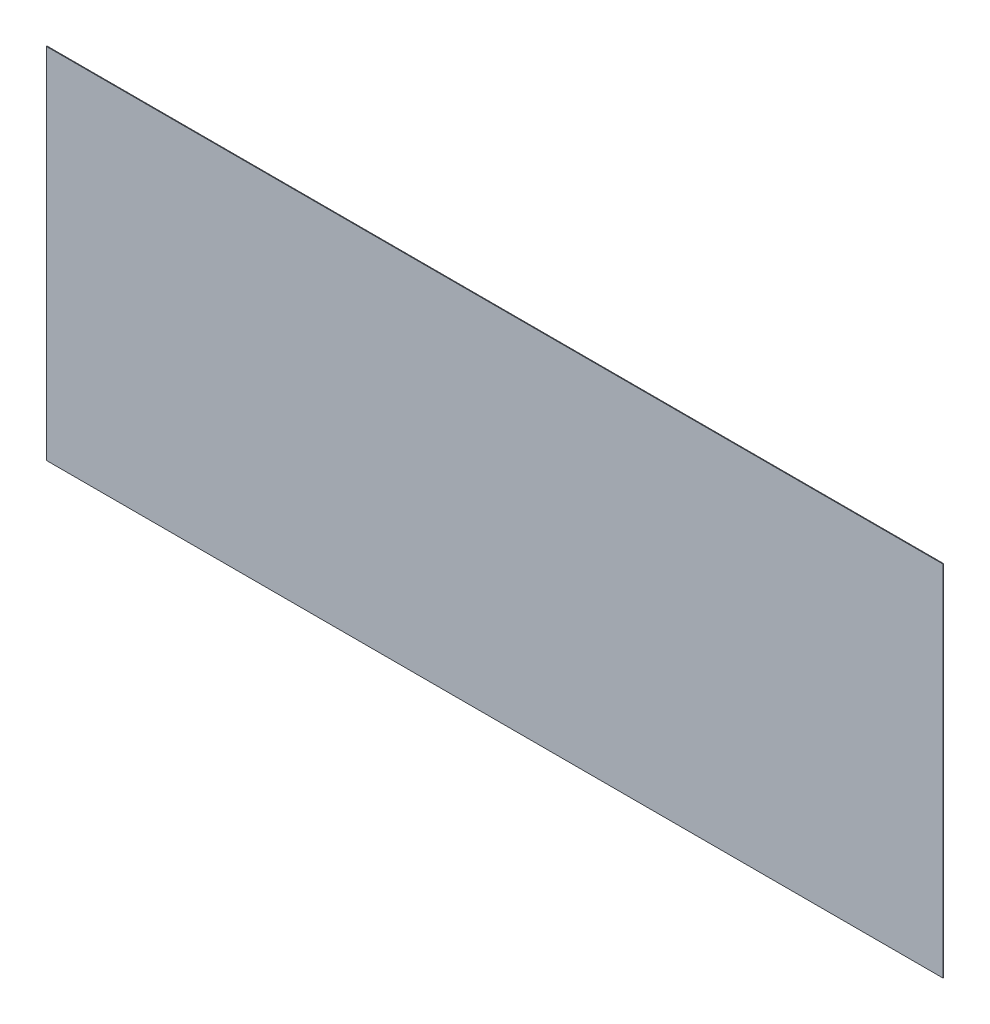
ISO-10303-21;
HEADER;
FILE_DESCRIPTION(('STEP AP214'),'2;1');
FILE_NAME('part.step','',(''),(''),'','','');
FILE_SCHEMA(('AUTOMOTIVE_DESIGN { 1 0 10303 214 1 1 1 1 }'));
ENDSEC;
DATA;
#1=APPLICATION_CONTEXT('core data for automotive mechanical design processes');
#2=APPLICATION_PROTOCOL_DEFINITION('international standard','automotive_design',2000,#1);
#3=PRODUCT_CONTEXT('',#1,'mechanical');
#4=PRODUCT('Part','Part','',(#3));
#5=PRODUCT_RELATED_PRODUCT_CATEGORY('part','',(#4));
#6=PRODUCT_DEFINITION_FORMATION('','',#4);
#7=PRODUCT_DEFINITION_CONTEXT('part definition',#1,'design');
#8=PRODUCT_DEFINITION('design','',#6,#7);
#9=PRODUCT_DEFINITION_SHAPE('','',#8);
#10=(LENGTH_UNIT() NAMED_UNIT(*) SI_UNIT(.MILLI.,.METRE.));
#11=(NAMED_UNIT(*) PLANE_ANGLE_UNIT() SI_UNIT($,.RADIAN.));
#12=(NAMED_UNIT(*) SI_UNIT($,.STERADIAN.) SOLID_ANGLE_UNIT());
#13=UNCERTAINTY_MEASURE_WITH_UNIT(LENGTH_MEASURE(1.E-05),#10,'distance_accuracy_value','');
#14=(GEOMETRIC_REPRESENTATION_CONTEXT(3) GLOBAL_UNCERTAINTY_ASSIGNED_CONTEXT((#13)) GLOBAL_UNIT_ASSIGNED_CONTEXT((#10,
#11,#12)) REPRESENTATION_CONTEXT('',''));
#15=CARTESIAN_POINT('',(0.,0.,0.));
#16=DIRECTION('',(0.,0.,1.));
#17=DIRECTION('',(1.,0.,0.));
#18=AXIS2_PLACEMENT_3D('',#15,#16,#17);
#19=CARTESIAN_POINT('',(-625.,500.,1.));
#20=DIRECTION('',(1.,0.,0.));
#21=DIRECTION('',(0.,0.,-1.));
#22=AXIS2_PLACEMENT_3D('',#19,#20,#21);
#23=PLANE('',#22);
#24=DIRECTION('',(0.,-1.,0.));
#25=VECTOR('',#24,1.);
#26=CARTESIAN_POINT('',(-625.,500.,0.));
#27=LINE('',#26,#25);
#28=CARTESIAN_POINT('',(-625.,500.,0.));
#29=VERTEX_POINT('',#28);
#30=CARTESIAN_POINT('',(-625.,0.,0.));
#31=VERTEX_POINT('',#30);
#32=EDGE_CURVE('E96',#29,#31,#27,.T.);
#33=ORIENTED_EDGE('',*,*,#32,.T.);
#34=DIRECTION('',(0.,0.,-1.));
#35=VECTOR('',#34,1.);
#36=CARTESIAN_POINT('',(-625.,0.,1.));
#37=LINE('',#36,#35);
#38=CARTESIAN_POINT('',(-625.,0.,1.));
#39=VERTEX_POINT('',#38);
#40=EDGE_CURVE('E11',#39,#31,#37,.T.);
#41=ORIENTED_EDGE('',*,*,#40,.F.);
#42=DIRECTION('',(0.,-1.,0.));
#43=VECTOR('',#42,1.);
#44=CARTESIAN_POINT('',(-625.,500.,1.));
#45=LINE('',#44,#43);
#46=CARTESIAN_POINT('',(-625.,500.,1.));
#47=VERTEX_POINT('',#46);
#48=EDGE_CURVE('E84',#47,#39,#45,.T.);
#49=ORIENTED_EDGE('',*,*,#48,.F.);
#50=DIRECTION('',(0.,0.,-1.));
#51=VECTOR('',#50,1.);
#52=CARTESIAN_POINT('',(-625.,500.,1.));
#53=LINE('',#52,#51);
#54=EDGE_CURVE('E92',#47,#29,#53,.T.);
#55=ORIENTED_EDGE('',*,*,#54,.T.);
#56=EDGE_LOOP('',(#33,#41,#49,#55));
#57=FACE_BOUND('',#56,.T.);
#58=ADVANCED_FACE('F33',(#57),#23,.F.);
#59=CARTESIAN_POINT('',(-625.,0.,1.));
#60=DIRECTION('',(0.,1.,0.));
#61=DIRECTION('',(0.,0.,1.));
#62=AXIS2_PLACEMENT_3D('',#59,#60,#61);
#63=PLANE('',#62);
#64=DIRECTION('',(1.,0.,0.));
#65=VECTOR('',#64,1.);
#66=CARTESIAN_POINT('',(-625.,0.,0.));
#67=LINE('',#66,#65);
#68=CARTESIAN_POINT('',(625.,0.,0.));
#69=VERTEX_POINT('',#68);
#70=EDGE_CURVE('E88',#31,#69,#67,.T.);
#71=ORIENTED_EDGE('',*,*,#70,.T.);
#72=DIRECTION('',(0.,0.,-1.));
#73=VECTOR('',#72,1.);
#74=CARTESIAN_POINT('',(625.,0.,1.));
#75=LINE('',#74,#73);
#76=CARTESIAN_POINT('',(625.,0.,1.));
#77=VERTEX_POINT('',#76);
#78=EDGE_CURVE('E41',#77,#69,#75,.T.);
#79=ORIENTED_EDGE('',*,*,#78,.F.);
#80=DIRECTION('',(1.,0.,0.));
#81=VECTOR('',#80,1.);
#82=CARTESIAN_POINT('',(-625.,0.,1.));
#83=LINE('',#82,#81);
#84=EDGE_CURVE('E79',#39,#77,#83,.T.);
#85=ORIENTED_EDGE('',*,*,#84,.F.);
#86=ORIENTED_EDGE('',*,*,#40,.T.);
#87=EDGE_LOOP('',(#71,#79,#85,#86));
#88=FACE_BOUND('',#87,.T.);
#89=ADVANCED_FACE('F87',(#88),#63,.F.);
#90=CARTESIAN_POINT('',(625.,500.,1.));
#91=DIRECTION('',(-1.,0.,0.));
#92=DIRECTION('',(0.,0.,1.));
#93=AXIS2_PLACEMENT_3D('',#90,#91,#92);
#94=PLANE('',#93);
#95=DIRECTION('',(0.,1.,0.));
#96=VECTOR('',#95,1.);
#97=CARTESIAN_POINT('',(625.,500.,0.));
#98=LINE('',#97,#96);
#99=CARTESIAN_POINT('',(625.,500.,0.));
#100=VERTEX_POINT('',#99);
#101=EDGE_CURVE('E66',#69,#100,#98,.T.);
#102=ORIENTED_EDGE('',*,*,#101,.T.);
#103=DIRECTION('',(0.,0.,-1.));
#104=VECTOR('',#103,1.);
#105=CARTESIAN_POINT('',(625.,500.,1.));
#106=LINE('',#105,#104);
#107=CARTESIAN_POINT('',(625.,500.,1.));
#108=VERTEX_POINT('',#107);
#109=EDGE_CURVE('E89',#108,#100,#106,.T.);
#110=ORIENTED_EDGE('',*,*,#109,.F.);
#111=DIRECTION('',(0.,1.,0.));
#112=VECTOR('',#111,1.);
#113=CARTESIAN_POINT('',(625.,500.,1.));
#114=LINE('',#113,#112);
#115=EDGE_CURVE('E82',#77,#108,#114,.T.);
#116=ORIENTED_EDGE('',*,*,#115,.F.);
#117=ORIENTED_EDGE('',*,*,#78,.T.);
#118=EDGE_LOOP('',(#102,#110,#116,#117));
#119=FACE_BOUND('',#118,.T.);
#120=ADVANCED_FACE('F90',(#119),#94,.F.);
#121=CARTESIAN_POINT('',(-625.,500.,1.));
#122=DIRECTION('',(0.,-1.,0.));
#123=DIRECTION('',(0.,0.,-1.));
#124=AXIS2_PLACEMENT_3D('',#121,#122,#123);
#125=PLANE('',#124);
#126=DIRECTION('',(-1.,0.,0.));
#127=VECTOR('',#126,1.);
#128=CARTESIAN_POINT('',(-625.,500.,0.));
#129=LINE('',#128,#127);
#130=EDGE_CURVE('E72',#100,#29,#129,.T.);
#131=ORIENTED_EDGE('',*,*,#130,.T.);
#132=ORIENTED_EDGE('',*,*,#54,.F.);
#133=DIRECTION('',(-1.,0.,0.));
#134=VECTOR('',#133,1.);
#135=CARTESIAN_POINT('',(-625.,500.,1.));
#136=LINE('',#135,#134);
#137=EDGE_CURVE('E49',#108,#47,#136,.T.);
#138=ORIENTED_EDGE('',*,*,#137,.F.);
#139=ORIENTED_EDGE('',*,*,#109,.T.);
#140=EDGE_LOOP('',(#131,#132,#138,#139));
#141=FACE_BOUND('',#140,.T.);
#142=ADVANCED_FACE('F103',(#141),#125,.F.);
#143=CARTESIAN_POINT('',(0.,0.,1.));
#144=DIRECTION('',(0.,0.,1.));
#145=DIRECTION('',(1.,0.,0.));
#146=AXIS2_PLACEMENT_3D('',#143,#144,#145);
#147=PLANE('',#146);
#148=ORIENTED_EDGE('',*,*,#48,.T.);
#149=ORIENTED_EDGE('',*,*,#84,.T.);
#150=ORIENTED_EDGE('',*,*,#115,.T.);
#151=ORIENTED_EDGE('',*,*,#137,.T.);
#152=EDGE_LOOP('',(#148,#149,#150,#151));
#153=FACE_BOUND('',#152,.T.);
#154=ADVANCED_FACE('F80',(#153),#147,.T.);
#155=CARTESIAN_POINT('',(0.,0.,0.));
#156=DIRECTION('',(0.,0.,1.));
#157=DIRECTION('',(1.,0.,0.));
#158=AXIS2_PLACEMENT_3D('',#155,#156,#157);
#159=PLANE('',#158);
#160=ORIENTED_EDGE('',*,*,#32,.F.);
#161=ORIENTED_EDGE('',*,*,#130,.F.);
#162=ORIENTED_EDGE('',*,*,#101,.F.);
#163=ORIENTED_EDGE('',*,*,#70,.F.);
#164=EDGE_LOOP('',(#160,#161,#162,#163));
#165=FACE_BOUND('',#164,.T.);
#166=ADVANCED_FACE('F106',(#165),#159,.F.);
#167=CLOSED_SHELL('',(#58,#89,#120,#142,#154,#166));
#168=MANIFOLD_SOLID_BREP('B2',#167);
#169=ADVANCED_BREP_SHAPE_REPRESENTATION('',(#18,#168),#14);
#170=SHAPE_DEFINITION_REPRESENTATION(#9,#169);
ENDSEC;
END-ISO-10303-21;
